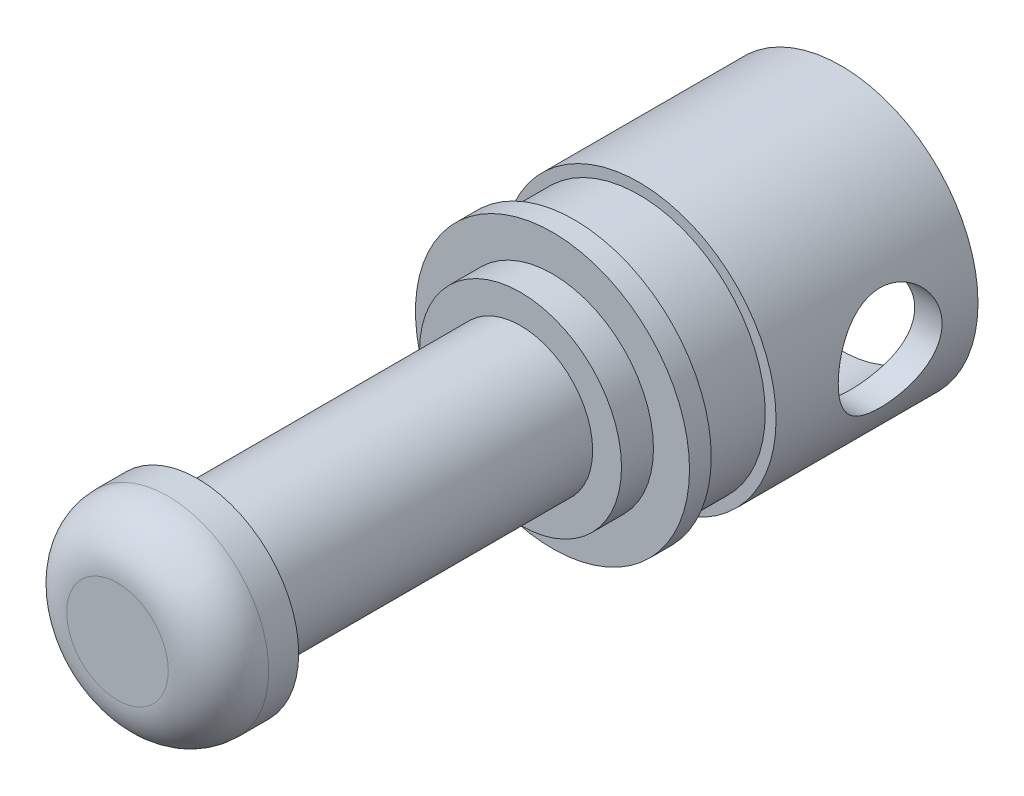
ISO-10303-21;
HEADER;
FILE_DESCRIPTION(('STEP AP214'),'2;1');
FILE_NAME('part.step','',(''),(''),'','','');
FILE_SCHEMA(('AUTOMOTIVE_DESIGN { 1 0 10303 214 1 1 1 1 }'));
ENDSEC;
DATA;
#1=APPLICATION_CONTEXT('core data for automotive mechanical design processes');
#2=APPLICATION_PROTOCOL_DEFINITION('international standard','automotive_design',2000,#1);
#3=PRODUCT_CONTEXT('',#1,'mechanical');
#4=PRODUCT('Part','Part','',(#3));
#5=PRODUCT_RELATED_PRODUCT_CATEGORY('part','',(#4));
#6=PRODUCT_DEFINITION_FORMATION('','',#4);
#7=PRODUCT_DEFINITION_CONTEXT('part definition',#1,'design');
#8=PRODUCT_DEFINITION('design','',#6,#7);
#9=PRODUCT_DEFINITION_SHAPE('','',#8);
#10=(LENGTH_UNIT() NAMED_UNIT(*) SI_UNIT(.MILLI.,.METRE.));
#11=(NAMED_UNIT(*) PLANE_ANGLE_UNIT() SI_UNIT($,.RADIAN.));
#12=(NAMED_UNIT(*) SI_UNIT($,.STERADIAN.) SOLID_ANGLE_UNIT());
#13=UNCERTAINTY_MEASURE_WITH_UNIT(LENGTH_MEASURE(1.E-05),#10,'distance_accuracy_value','');
#14=(GEOMETRIC_REPRESENTATION_CONTEXT(3) GLOBAL_UNCERTAINTY_ASSIGNED_CONTEXT((#13)) GLOBAL_UNIT_ASSIGNED_CONTEXT((#10,
#11,#12)) REPRESENTATION_CONTEXT('',''));
#15=CARTESIAN_POINT('',(0.,0.,0.));
#16=DIRECTION('',(0.,0.,1.));
#17=DIRECTION('',(1.,0.,0.));
#18=AXIS2_PLACEMENT_3D('',#15,#16,#17);
#19=CARTESIAN_POINT('',(0.,0.,12.02));
#20=DIRECTION('',(0.,0.,1.));
#21=DIRECTION('',(1.,0.,0.));
#22=AXIS2_PLACEMENT_3D('',#19,#20,#21);
#23=PLANE('',#22);
#24=CARTESIAN_POINT('',(0.,0.,12.02));
#25=DIRECTION('',(0.,0.,-1.));
#26=DIRECTION('',(1.,0.,0.));
#27=AXIS2_PLACEMENT_3D('',#24,#25,#26);
#28=CIRCLE('',#27,0.88);
#29=CARTESIAN_POINT('',(0.88,0.,12.02));
#30=VERTEX_POINT('',#29);
#31=CARTESIAN_POINT('',(-0.88,0.,12.02));
#32=VERTEX_POINT('',#31);
#33=EDGE_CURVE('E38',#30,#32,#28,.T.);
#34=ORIENTED_EDGE('',*,*,#33,.F.);
#35=CARTESIAN_POINT('',(0.,0.,12.02));
#36=DIRECTION('',(0.,0.,-1.));
#37=DIRECTION('',(-1.,0.,0.));
#38=AXIS2_PLACEMENT_3D('',#35,#36,#37);
#39=CIRCLE('',#38,0.88);
#40=EDGE_CURVE('E34',#32,#30,#39,.T.);
#41=ORIENTED_EDGE('',*,*,#40,.F.);
#42=EDGE_LOOP('',(#34,#41));
#43=FACE_BOUND('',#42,.T.);
#44=ADVANCED_FACE('F17',(#43),#23,.T.);
#45=CARTESIAN_POINT('',(0.,0.,11.15));
#46=DIRECTION('',(0.,0.,-1.));
#47=DIRECTION('',(-1.,0.,0.));
#48=AXIS2_PLACEMENT_3D('',#45,#46,#47);
#49=TOROIDAL_SURFACE('',#48,0.88,0.87);
#50=CARTESIAN_POINT('',(0.,0.,11.15));
#51=DIRECTION('',(0.,0.,1.));
#52=DIRECTION('',(1.,0.,0.));
#53=AXIS2_PLACEMENT_3D('',#50,#51,#52);
#54=CIRCLE('',#53,1.75);
#55=CARTESIAN_POINT('',(1.75,0.,11.15));
#56=VERTEX_POINT('',#55);
#57=EDGE_CURVE('E44',#56,#56,#54,.F.);
#58=ORIENTED_EDGE('',*,*,#57,.F.);
#59=EDGE_LOOP('',(#58));
#60=FACE_BOUND('',#59,.T.);
#61=ORIENTED_EDGE('',*,*,#33,.T.);
#62=ORIENTED_EDGE('',*,*,#40,.T.);
#63=EDGE_LOOP('',(#61,#62));
#64=FACE_BOUND('',#63,.T.);
#65=ADVANCED_FACE('F43',(#60,#64),#49,.T.);
#66=CARTESIAN_POINT('',(0.,0.,0.));
#67=DIRECTION('',(0.,0.,1.));
#68=DIRECTION('',(1.,0.,0.));
#69=AXIS2_PLACEMENT_3D('',#66,#67,#68);
#70=CYLINDRICAL_SURFACE('',#69,1.75);
#71=ORIENTED_EDGE('',*,*,#57,.T.);
#72=EDGE_LOOP('',(#71));
#73=FACE_BOUND('',#72,.T.);
#74=CARTESIAN_POINT('',(0.,0.,10.6298091430472));
#75=DIRECTION('',(0.,0.,1.));
#76=DIRECTION('',(1.,0.,0.));
#77=AXIS2_PLACEMENT_3D('',#74,#75,#76);
#78=CIRCLE('',#77,1.75);
#79=CARTESIAN_POINT('',(1.75,0.,10.6298091430472));
#80=VERTEX_POINT('',#79);
#81=EDGE_CURVE('E74',#80,#80,#78,.F.);
#82=ORIENTED_EDGE('',*,*,#81,.F.);
#83=EDGE_LOOP('',(#82));
#84=FACE_BOUND('',#83,.T.);
#85=ADVANCED_FACE('F60',(#73,#84),#70,.T.);
#86=CARTESIAN_POINT('',(-0.0662132772985357,1.74874692334522,10.6298091430472));
#87=DIRECTION('',(0.,0.,-1.));
#88=DIRECTION('',(-1.,0.,0.));
#89=AXIS2_PLACEMENT_3D('',#86,#87,#88);
#90=PLANE('',#89);
#91=ORIENTED_EDGE('',*,*,#81,.T.);
#92=EDGE_LOOP('',(#91));
#93=FACE_BOUND('',#92,.T.);
#94=CARTESIAN_POINT('',(0.,0.,10.6298091430472));
#95=DIRECTION('',(0.,0.,1.));
#96=DIRECTION('',(1.,0.,0.));
#97=AXIS2_PLACEMENT_3D('',#94,#95,#96);
#98=CIRCLE('',#97,1.25);
#99=CARTESIAN_POINT('',(1.25,0.,10.6298091430472));
#100=VERTEX_POINT('',#99);
#101=EDGE_CURVE('E78',#100,#100,#98,.F.);
#102=ORIENTED_EDGE('',*,*,#101,.F.);
#103=EDGE_LOOP('',(#102));
#104=FACE_BOUND('',#103,.T.);
#105=ADVANCED_FACE('F160',(#93,#104),#90,.T.);
#106=CARTESIAN_POINT('',(0.,0.,0.));
#107=DIRECTION('',(0.,0.,1.));
#108=DIRECTION('',(1.,0.,0.));
#109=AXIS2_PLACEMENT_3D('',#106,#107,#108);
#110=CYLINDRICAL_SURFACE('',#109,1.25);
#111=CARTESIAN_POINT('',(0.,0.,5.0348339473795));
#112=DIRECTION('',(0.,0.,1.));
#113=DIRECTION('',(1.,0.,0.));
#114=AXIS2_PLACEMENT_3D('',#111,#112,#113);
#115=CIRCLE('',#114,1.25);
#116=CARTESIAN_POINT('',(1.25,0.,5.0348339473795));
#117=VERTEX_POINT('',#116);
#118=EDGE_CURVE('E83',#117,#117,#115,.F.);
#119=ORIENTED_EDGE('',*,*,#118,.F.);
#120=EDGE_LOOP('',(#119));
#121=FACE_BOUND('',#120,.T.);
#122=ORIENTED_EDGE('',*,*,#101,.T.);
#123=EDGE_LOOP('',(#122));
#124=FACE_BOUND('',#123,.T.);
#125=ADVANCED_FACE('F157',(#121,#124),#110,.T.);
#126=CARTESIAN_POINT('',(-0.0662132772985357,1.74874692334522,5.0348339473795));
#127=DIRECTION('',(0.,0.,1.));
#128=DIRECTION('',(1.,0.,0.));
#129=AXIS2_PLACEMENT_3D('',#126,#127,#128);
#130=PLANE('',#129);
#131=CARTESIAN_POINT('',(0.,0.,5.0348339473795));
#132=DIRECTION('',(0.,0.,1.));
#133=DIRECTION('',(1.,0.,0.));
#134=AXIS2_PLACEMENT_3D('',#131,#132,#133);
#135=CIRCLE('',#134,1.75);
#136=CARTESIAN_POINT('',(1.75,0.,5.0348339473795));
#137=VERTEX_POINT('',#136);
#138=EDGE_CURVE('E88',#137,#137,#135,.F.);
#139=ORIENTED_EDGE('',*,*,#138,.F.);
#140=EDGE_LOOP('',(#139));
#141=FACE_BOUND('',#140,.T.);
#142=ORIENTED_EDGE('',*,*,#118,.T.);
#143=EDGE_LOOP('',(#142));
#144=FACE_BOUND('',#143,.T.);
#145=ADVANCED_FACE('F153',(#141,#144),#130,.T.);
#146=CARTESIAN_POINT('',(0.,0.,0.));
#147=DIRECTION('',(0.,0.,1.));
#148=DIRECTION('',(1.,0.,0.));
#149=AXIS2_PLACEMENT_3D('',#146,#147,#148);
#150=CYLINDRICAL_SURFACE('',#149,1.75);
#151=ORIENTED_EDGE('',*,*,#138,.T.);
#152=EDGE_LOOP('',(#151));
#153=FACE_BOUND('',#152,.T.);
#154=CARTESIAN_POINT('',(0.,0.,4.480935244148));
#155=DIRECTION('',(0.,0.,1.));
#156=DIRECTION('',(1.,0.,0.));
#157=AXIS2_PLACEMENT_3D('',#154,#155,#156);
#158=CIRCLE('',#157,1.75);
#159=CARTESIAN_POINT('',(1.75,0.,4.480935244148));
#160=VERTEX_POINT('',#159);
#161=EDGE_CURVE('E91',#160,#160,#158,.F.);
#162=ORIENTED_EDGE('',*,*,#161,.F.);
#163=EDGE_LOOP('',(#162));
#164=FACE_BOUND('',#163,.T.);
#165=ADVANCED_FACE('F149',(#153,#164),#150,.T.);
#166=CARTESIAN_POINT('',(-0.889222465921489,1.50724364523474,4.480935244148));
#167=DIRECTION('',(0.,0.,1.));
#168=DIRECTION('',(1.,0.,0.));
#169=AXIS2_PLACEMENT_3D('',#166,#167,#168);
#170=PLANE('',#169);
#171=ORIENTED_EDGE('',*,*,#161,.T.);
#172=EDGE_LOOP('',(#171));
#173=FACE_BOUND('',#172,.T.);
#174=CARTESIAN_POINT('',(0.,0.,4.480935244148));
#175=DIRECTION('',(0.,0.,1.));
#176=DIRECTION('',(1.,0.,0.));
#177=AXIS2_PLACEMENT_3D('',#174,#175,#176);
#178=CIRCLE('',#177,2.375);
#179=CARTESIAN_POINT('',(2.375,0.,4.480935244148));
#180=VERTEX_POINT('',#179);
#181=EDGE_CURVE('E94',#180,#180,#178,.F.);
#182=ORIENTED_EDGE('',*,*,#181,.F.);
#183=EDGE_LOOP('',(#182));
#184=FACE_BOUND('',#183,.T.);
#185=ADVANCED_FACE('F145',(#173,#184),#170,.T.);
#186=CARTESIAN_POINT('',(0.,0.,0.));
#187=DIRECTION('',(0.,0.,1.));
#188=DIRECTION('',(1.,0.,0.));
#189=AXIS2_PLACEMENT_3D('',#186,#187,#188);
#190=CYLINDRICAL_SURFACE('',#189,2.375);
#191=ORIENTED_EDGE('',*,*,#181,.T.);
#192=EDGE_LOOP('',(#191));
#193=FACE_BOUND('',#192,.T.);
#194=CARTESIAN_POINT('',(0.,0.,4.10469700824041));
#195=DIRECTION('',(0.,0.,1.));
#196=DIRECTION('',(1.,0.,0.));
#197=AXIS2_PLACEMENT_3D('',#194,#195,#196);
#198=CIRCLE('',#197,2.375);
#199=CARTESIAN_POINT('',(2.375,0.,4.10469700824041));
#200=VERTEX_POINT('',#199);
#201=EDGE_CURVE('E97',#200,#200,#198,.F.);
#202=ORIENTED_EDGE('',*,*,#201,.F.);
#203=EDGE_LOOP('',(#202));
#204=FACE_BOUND('',#203,.T.);
#205=ADVANCED_FACE('F141',(#193,#204),#190,.T.);
#206=CARTESIAN_POINT('',(-0.889222465921489,1.50724364523474,4.10469700824041));
#207=DIRECTION('',(0.,0.,-1.));
#208=DIRECTION('',(-1.,0.,0.));
#209=AXIS2_PLACEMENT_3D('',#206,#207,#208);
#210=PLANE('',#209);
#211=CARTESIAN_POINT('',(0.,0.,4.10469700824041));
#212=DIRECTION('',(0.,0.,1.));
#213=DIRECTION('',(1.,0.,0.));
#214=AXIS2_PLACEMENT_3D('',#211,#212,#213);
#215=CIRCLE('',#214,2.1875);
#216=CARTESIAN_POINT('',(2.1875,0.,4.10469700824041));
#217=VERTEX_POINT('',#216);
#218=EDGE_CURVE('E100',#217,#217,#215,.F.);
#219=ORIENTED_EDGE('',*,*,#218,.F.);
#220=EDGE_LOOP('',(#219));
#221=FACE_BOUND('',#220,.T.);
#222=ORIENTED_EDGE('',*,*,#201,.T.);
#223=EDGE_LOOP('',(#222));
#224=FACE_BOUND('',#223,.T.);
#225=ADVANCED_FACE('F137',(#221,#224),#210,.T.);
#226=CARTESIAN_POINT('',(0.,0.,0.));
#227=DIRECTION('',(0.,0.,1.));
#228=DIRECTION('',(1.,0.,0.));
#229=AXIS2_PLACEMENT_3D('',#226,#227,#228);
#230=CYLINDRICAL_SURFACE('',#229,2.1875);
#231=ORIENTED_EDGE('',*,*,#218,.T.);
#232=EDGE_LOOP('',(#231));
#233=FACE_BOUND('',#232,.T.);
#234=CARTESIAN_POINT('',(0.,0.,2.980935244148));
#235=DIRECTION('',(0.,0.,1.));
#236=DIRECTION('',(1.,0.,0.));
#237=AXIS2_PLACEMENT_3D('',#234,#235,#236);
#238=CIRCLE('',#237,2.1875);
#239=CARTESIAN_POINT('',(2.1875,0.,2.980935244148));
#240=VERTEX_POINT('',#239);
#241=EDGE_CURVE('E103',#240,#240,#238,.F.);
#242=ORIENTED_EDGE('',*,*,#241,.F.);
#243=EDGE_LOOP('',(#242));
#244=FACE_BOUND('',#243,.T.);
#245=ADVANCED_FACE('F133',(#233,#244),#230,.T.);
#246=CARTESIAN_POINT('',(-0.889222465921489,1.50724364523474,2.980935244148));
#247=DIRECTION('',(0.,0.,1.));
#248=DIRECTION('',(1.,0.,0.));
#249=AXIS2_PLACEMENT_3D('',#246,#247,#248);
#250=PLANE('',#249);
#251=CARTESIAN_POINT('',(0.,0.,2.980935244148));
#252=DIRECTION('',(0.,0.,1.));
#253=DIRECTION('',(1.,0.,0.));
#254=AXIS2_PLACEMENT_3D('',#251,#252,#253);
#255=CIRCLE('',#254,2.375);
#256=CARTESIAN_POINT('',(2.375,0.,2.980935244148));
#257=VERTEX_POINT('',#256);
#258=EDGE_CURVE('E106',#257,#257,#255,.F.);
#259=ORIENTED_EDGE('',*,*,#258,.F.);
#260=EDGE_LOOP('',(#259));
#261=FACE_BOUND('',#260,.T.);
#262=ORIENTED_EDGE('',*,*,#241,.T.);
#263=EDGE_LOOP('',(#262));
#264=FACE_BOUND('',#263,.T.);
#265=ADVANCED_FACE('F129',(#261,#264),#250,.T.);
#266=CARTESIAN_POINT('',(0.,0.,0.));
#267=DIRECTION('',(0.,0.,1.));
#268=DIRECTION('',(1.,0.,0.));
#269=AXIS2_PLACEMENT_3D('',#266,#267,#268);
#270=CYLINDRICAL_SURFACE('',#269,2.375);
#271=CARTESIAN_POINT('',(0.,0.,-0.519064755852001));
#272=DIRECTION('',(0.,0.,1.));
#273=DIRECTION('',(1.,0.,0.));
#274=AXIS2_PLACEMENT_3D('',#271,#272,#273);
#275=CIRCLE('',#274,2.375);
#276=CARTESIAN_POINT('',(2.375,0.,-0.519064755852001));
#277=VERTEX_POINT('',#276);
#278=EDGE_CURVE('E109',#277,#277,#275,.T.);
#279=ORIENTED_EDGE('',*,*,#278,.T.);
#280=EDGE_LOOP('',(#279));
#281=FACE_BOUND('',#280,.T.);
#282=ORIENTED_EDGE('',*,*,#258,.T.);
#283=EDGE_LOOP('',(#282));
#284=FACE_BOUND('',#283,.T.);
#285=CARTESIAN_POINT('',(2.19786828540748,-0.9,1.00335818543237));
#286=CARTESIAN_POINT('',(2.19787029901936,-0.899997954880836,1.05187777166198));
#287=CARTESIAN_POINT('',(2.19949473336649,-0.896059081819069,1.10041910933173));
#288=CARTESIAN_POINT('',(2.20578213547849,-0.880464406069073,1.19606320850285));
#289=CARTESIAN_POINT('',(2.21044776480495,-0.868801843699061,1.2431646720336));
#290=CARTESIAN_POINT('',(2.22221022151569,-0.838255036308254,1.33447798457018));
#291=CARTESIAN_POINT('',(2.22930019346178,-0.81939113755076,1.37869756751418));
#292=CARTESIAN_POINT('',(2.24510284344058,-0.775042135694973,1.4633525914942));
#293=CARTESIAN_POINT('',(2.2538157358467,-0.749556157702849,1.50378753155105));
#294=CARTESIAN_POINT('',(2.27237880139204,-0.691299400381519,1.58178938268127));
#295=CARTESIAN_POINT('',(2.28226291328788,-0.65824655745323,1.61913761334668));
#296=CARTESIAN_POINT('',(2.30177379376686,-0.586384901121995,1.68792199402992));
#297=CARTESIAN_POINT('',(2.31140046055085,-0.547573849390684,1.71935583418266));
#298=CARTESIAN_POINT('',(2.32971775696357,-0.463625326805697,1.7764808393245));
#299=CARTESIAN_POINT('',(2.33836349034561,-0.418313210102452,1.80193081619328));
#300=CARTESIAN_POINT('',(2.35332410946359,-0.323689143022334,1.84473449384934));
#301=CARTESIAN_POINT('',(2.35964183060601,-0.274382148143775,1.86209805035564));
#302=CARTESIAN_POINT('',(2.36787854457283,-0.187405510573351,1.88443511613629));
#303=CARTESIAN_POINT('',(2.37053334371841,-0.150333336344609,1.89151490024203));
#304=CARTESIAN_POINT('',(2.37409456705135,-0.0755117178548224,1.90097693567649));
#305=CARTESIAN_POINT('',(2.375001179895,-0.0377623471175418,1.90335969388742));
#306=CARTESIAN_POINT('',(2.3749984795776,0.0486608709097025,1.9033562416248));
#307=CARTESIAN_POINT('',(2.37348955919515,0.0973432892434525,1.89939519644532));
#308=CARTESIAN_POINT('',(2.36761130316949,0.193281248913484,1.88370440549388));
#309=CARTESIAN_POINT('',(2.36323967267138,0.240535613648357,1.87196842695793));
#310=CARTESIAN_POINT('',(2.35210800749596,0.332173964626392,1.84120736339772));
#311=CARTESIAN_POINT('',(2.34535358067677,0.376564403370612,1.82219938406816));
#312=CARTESIAN_POINT('',(2.33012781234027,0.461513005987586,1.77750984811322));
#313=CARTESIAN_POINT('',(2.32165632180956,0.502070836803644,1.7518277122242));
#314=CARTESIAN_POINT('',(2.30345929207839,0.579967967502448,1.69335850521436));
#315=CARTESIAN_POINT('',(2.29369774313747,0.617120196221575,1.66033351609326));
#316=CARTESIAN_POINT('',(2.27419420485044,0.685516804393749,1.588613447544));
#317=CARTESIAN_POINT('',(2.26445222739562,0.716758287564409,1.54991560479906));
#318=CARTESIAN_POINT('',(2.24566774093994,0.773650833324982,1.46609976530032));
#319=CARTESIAN_POINT('',(2.23666797347588,0.799032809210327,1.42078875103538));
#320=CARTESIAN_POINT('',(2.22096145717471,0.841710877413735,1.32617093902632));
#321=CARTESIAN_POINT('',(2.21425174393602,0.859017433845175,1.27686940999654));
#322=CARTESIAN_POINT('',(2.20548527434867,0.881224528890244,1.19003494769746));
#323=CARTESIAN_POINT('',(2.20264958224555,0.888248451323271,1.15311107004654));
#324=CARTESIAN_POINT('',(2.19884044197844,0.897636642390358,1.07858181555175));
#325=CARTESIAN_POINT('',(2.1978667242078,0.900001585627992,1.04097653816804));
#326=CARTESIAN_POINT('',(2.19787029901936,0.899997954880836,0.954838599202761));
#327=CARTESIAN_POINT('',(2.19949473336649,0.896059081819069,0.906297261533007));
#328=CARTESIAN_POINT('',(2.20578213547849,0.880464406069073,0.810653162361888));
#329=CARTESIAN_POINT('',(2.21044776480495,0.868801843699061,0.763551698831139));
#330=CARTESIAN_POINT('',(2.22221022151569,0.838255036308254,0.672238386294561));
#331=CARTESIAN_POINT('',(2.22930019346178,0.81939113755076,0.628018803350561));
#332=CARTESIAN_POINT('',(2.24510284344058,0.775042135694973,0.543363779370538));
#333=CARTESIAN_POINT('',(2.2538157358467,0.749556157702849,0.502928839313692));
#334=CARTESIAN_POINT('',(2.27237880139204,0.691299400381519,0.424926988183469));
#335=CARTESIAN_POINT('',(2.28226291328788,0.65824655745323,0.387578757518063));
#336=CARTESIAN_POINT('',(2.30177379376686,0.586384901121995,0.318794376834817));
#337=CARTESIAN_POINT('',(2.31140046055085,0.547573849390684,0.287360536682078));
#338=CARTESIAN_POINT('',(2.32971775696357,0.463625326805697,0.230235531540241));
#339=CARTESIAN_POINT('',(2.33836349034561,0.418313210102452,0.204785554671459));
#340=CARTESIAN_POINT('',(2.35332410946359,0.323689143022334,0.161981877015402));
#341=CARTESIAN_POINT('',(2.35964183060601,0.274382148143775,0.144618320509102));
#342=CARTESIAN_POINT('',(2.36787854457283,0.187405510573351,0.122281254728446));
#343=CARTESIAN_POINT('',(2.37053334371841,0.150333336344609,0.115201470622708));
#344=CARTESIAN_POINT('',(2.37409456705135,0.0755117178548222,0.105739435188254));
#345=CARTESIAN_POINT('',(2.375001179895,0.0377623471175415,0.103356676977324));
#346=CARTESIAN_POINT('',(2.3749984795776,-0.0486608709097028,0.103360129239943));
#347=CARTESIAN_POINT('',(2.37348955919515,-0.0973432892434528,0.10732117441942));
#348=CARTESIAN_POINT('',(2.36761130316949,-0.193281248913485,0.123011965370865));
#349=CARTESIAN_POINT('',(2.36323967267138,-0.240535613648358,0.13474794390681));
#350=CARTESIAN_POINT('',(2.35210800749596,-0.332173964626392,0.165509007467023));
#351=CARTESIAN_POINT('',(2.34535358067677,-0.376564403370612,0.18451698679658));
#352=CARTESIAN_POINT('',(2.33012781234027,-0.461513005987586,0.229206522751524));
#353=CARTESIAN_POINT('',(2.32165632180956,-0.502070836803644,0.254888658640545));
#354=CARTESIAN_POINT('',(2.30345929207839,-0.579967967502448,0.313357865650381));
#355=CARTESIAN_POINT('',(2.29369774313747,-0.617120196221575,0.346382854771479));
#356=CARTESIAN_POINT('',(2.27419420485044,-0.685516804393749,0.418102923320739));
#357=CARTESIAN_POINT('',(2.26445222739562,-0.716758287564409,0.456800766065676));
#358=CARTESIAN_POINT('',(2.24566774093994,-0.773650833324982,0.540616605564421));
#359=CARTESIAN_POINT('',(2.23666797347588,-0.799032809210327,0.585927619829363));
#360=CARTESIAN_POINT('',(2.22096145717471,-0.841710877413735,0.680545431838419));
#361=CARTESIAN_POINT('',(2.21425174393602,-0.859017433845175,0.729846960868198));
#362=CARTESIAN_POINT('',(2.20548527434867,-0.881224528890244,0.81668142316728));
#363=CARTESIAN_POINT('',(2.20264958224555,-0.888248451323271,0.853605300818196));
#364=CARTESIAN_POINT('',(2.19884044197844,-0.897636642390358,0.928134555312989));
#365=CARTESIAN_POINT('',(2.1978667242078,-0.900001585627992,0.965739832696698));
#366=CARTESIAN_POINT('',(2.19786828540748,-0.9,1.00335818543237));
#367=B_SPLINE_CURVE_WITH_KNOTS('',3,(#285,#286,#287,#288,#289,#290,#291,#292,#293,#294,#295,
#296,#297,#298,#299,#300,#301,#302,#303,#304,#305,#306,#307,#308,#309,#310,#311,#312,#313,#314,
#315,#316,#317,#318,#319,#320,#321,#322,#323,#324,#325,#326,#327,#328,#329,#330,#331,#332,#333,
#334,#335,#336,#337,#338,#339,#340,#341,#342,#343,#344,#345,#346,#347,#348,#349,#350,#351,#352,
#353,#354,#355,#356,#357,#358,#359,#360,#361,#362,#363,#364,#365,#366),.UNSPECIFIED.,.T.,.F.,(4,
2,2,2,2,2,2,2,2,2,2,2,2,2,2,2,2,2,2,2,2,2,2,2,2,2,2,2,2,2,2,2,2,2,2,2,2,2,2,2,4),(0.,
0.145414768599287,0.290956970969297,0.436090973755428,0.581244161069677,0.733100601357813,
0.885016226627322,1.04228115639521,1.19935390697636,1.31254225165257,1.42571838087549,
1.57155807132253,1.71751481564465,1.8631303208094,2.00875846846361,2.16006291877245,
2.31144131776353,2.46879015532588,2.62593453042972,2.73869427821365,2.85143769758778,
2.99685246618707,3.14239466855708,3.28752867134321,3.43268185865746,3.5845382989456,
3.7364539242151,3.893718853983,4.05079160456414,4.16397994924036,4.27715607846327,
4.42299576891032,4.56895251323243,4.71456801839719,4.86019616605139,5.01150061636023,
5.16287901535131,5.32022785291366,5.4773722280175,5.59013197580143,5.70287539517557),.UNSPECIFIED.);
#368=CARTESIAN_POINT('',(2.19786828540748,-0.9,1.00335818543237));
#369=VERTEX_POINT('',#368);
#370=EDGE_CURVE('E112',#369,#369,#367,.T.);
#371=ORIENTED_EDGE('',*,*,#370,.T.);
#372=EDGE_LOOP('',(#371));
#373=FACE_BOUND('',#372,.T.);
#374=ADVANCED_FACE('F124',(#281,#284,#373),#270,.T.);
#375=CARTESIAN_POINT('',(0.,0.,-0.519064755852001));
#376=DIRECTION('',(0.,0.,1.));
#377=DIRECTION('',(1.,0.,0.));
#378=AXIS2_PLACEMENT_3D('',#375,#376,#377);
#379=PLANE('',#378);
#380=ORIENTED_EDGE('',*,*,#278,.F.);
#381=EDGE_LOOP('',(#380));
#382=FACE_BOUND('',#381,.T.);
#383=CARTESIAN_POINT('',(0.,0.,-0.519064755852001));
#384=DIRECTION('',(0.,0.,-1.));
#385=DIRECTION('',(-1.,0.,0.));
#386=AXIS2_PLACEMENT_3D('',#383,#384,#385);
#387=CIRCLE('',#386,1.9);
#388=CARTESIAN_POINT('',(-1.9,0.,-0.519064755852001));
#389=VERTEX_POINT('',#388);
#390=EDGE_CURVE('E119',#389,#389,#387,.F.);
#391=ORIENTED_EDGE('',*,*,#390,.T.);
#392=EDGE_LOOP('',(#391));
#393=FACE_BOUND('',#392,.T.);
#394=ADVANCED_FACE('F128',(#382,#393),#379,.F.);
#395=CARTESIAN_POINT('',(0.,0.,1.00335818543237));
#396=DIRECTION('',(1.,0.,0.));
#397=DIRECTION('',(0.,0.,-1.));
#398=AXIS2_PLACEMENT_3D('',#395,#396,#397);
#399=CYLINDRICAL_SURFACE('',#398,0.9);
#400=ORIENTED_EDGE('',*,*,#370,.F.);
#401=EDGE_LOOP('',(#400));
#402=FACE_BOUND('',#401,.T.);
#403=CARTESIAN_POINT('',(1.9,0.,0.10335818543237));
#404=CARTESIAN_POINT('',(1.89999871690515,-0.0476738019602449,0.103359650099982));
#405=CARTESIAN_POINT('',(1.89818851073326,-0.0953618199562382,0.10716346976264));
#406=CARTESIAN_POINT('',(1.89113430900034,-0.189300390612177,0.122204474372804));
#407=CARTESIAN_POINT('',(1.88588809637015,-0.235549994944752,0.133446458813708));
#408=CARTESIAN_POINT('',(1.87251394322574,-0.325176425408232,0.162835494242659));
#409=CARTESIAN_POINT('',(1.86439507514142,-0.368561791317893,0.180960819304037));
#410=CARTESIAN_POINT('',(1.84603282613723,-0.451636227689504,0.223483661304181));
#411=CARTESIAN_POINT('',(1.83578907857407,-0.491324658538608,0.247882260856944));
#412=CARTESIAN_POINT('',(1.81346972692596,-0.568352151029684,0.303811168724101));
#413=CARTESIAN_POINT('',(1.80132384058499,-0.605436935599023,0.335663202014357));
#414=CARTESIAN_POINT('',(1.7768202831698,-0.673970988653647,0.404911247083715));
#415=CARTESIAN_POINT('',(1.7644624635201,-0.705416110395334,0.442311301606233));
#416=CARTESIAN_POINT('',(1.73997498293743,-0.76391115640832,0.524651059040854));
#417=CARTESIAN_POINT('',(1.72791814241388,-0.790516064417238,0.569930729367835));
#418=CARTESIAN_POINT('',(1.70657464300839,-0.835601794308674,0.664943214327021));
#419=CARTESIAN_POINT('',(1.69728405852849,-0.854094146555782,0.714669586974628));
#420=CARTESIAN_POINT('',(1.68468617286531,-0.878618684025586,0.804316107960125));
#421=CARTESIAN_POINT('',(1.68046360808677,-0.886610389554073,0.843578739403436));
#422=CARTESIAN_POINT('',(1.6747802100049,-0.897300740829197,0.923010415518419));
#423=CARTESIAN_POINT('',(1.67331832778625,-0.900001396913171,0.963179110060763));
#424=CARTESIAN_POINT('',(1.67332208563498,-0.899998354286699,1.05069343873212));
#425=CARTESIAN_POINT('',(1.67535551218073,-0.896246431134255,1.09804309996162));
#426=CARTESIAN_POINT('',(1.68319541296021,-0.881430614113804,1.19127604835341));
#427=CARTESIAN_POINT('',(1.68900509696711,-0.870360499735132,1.23715805318383));
#428=CARTESIAN_POINT('',(1.70357907120777,-0.841472637670431,1.3259999925228));
#429=CARTESIAN_POINT('',(1.71233062071786,-0.823683946643738,1.36897158339641));
#430=CARTESIAN_POINT('',(1.73178220617609,-0.781958241299157,1.45132524781876));
#431=CARTESIAN_POINT('',(1.74248275984672,-0.758019592645934,1.490706363433));
#432=CARTESIAN_POINT('',(1.76558808547428,-0.702611514902505,1.56794540485739));
#433=CARTESIAN_POINT('',(1.77806030075188,-0.670718189607947,1.60547916426623));
#434=CARTESIAN_POINT('',(1.80275774516848,-0.601186729641264,1.67491608184963));
#435=CARTESIAN_POINT('',(1.81498284388746,-0.563545646737322,1.70681633218166));
#436=CARTESIAN_POINT('',(1.83867565936106,-0.480861100084789,1.765922884903));
#437=CARTESIAN_POINT('',(1.8500554051105,-0.435510948092183,1.7927383949816));
#438=CARTESIAN_POINT('',(1.86990179380007,-0.340323097934722,1.83819518812594));
#439=CARTESIAN_POINT('',(1.87837215235864,-0.290491226896771,1.85684690570173));
#440=CARTESIAN_POINT('',(1.8897994020737,-0.200467441271667,1.88166852981734));
#441=CARTESIAN_POINT('',(1.89359895561935,-0.16090811298016,1.88977763705899));
#442=CARTESIAN_POINT('',(1.8986995091319,-0.0809024636033595,1.90062246292888));
#443=CARTESIAN_POINT('',(1.90000108884404,-0.0404563505330944,1.90335942836043));
#444=CARTESIAN_POINT('',(1.89999871690515,0.0476738019602451,1.90335672076476));
#445=CARTESIAN_POINT('',(1.89818851073326,0.0953618199562383,1.8995529011021));
#446=CARTESIAN_POINT('',(1.89113430900034,0.189300390612177,1.88451189649194));
#447=CARTESIAN_POINT('',(1.88588809637015,0.235549994944752,1.87326991205103));
#448=CARTESIAN_POINT('',(1.87251394322574,0.325176425408232,1.84388087662208));
#449=CARTESIAN_POINT('',(1.86439507514142,0.368561791317893,1.8257555515607));
#450=CARTESIAN_POINT('',(1.84603282613723,0.451636227689504,1.78323270956056));
#451=CARTESIAN_POINT('',(1.83578907857407,0.491324658538609,1.7588341100078));
#452=CARTESIAN_POINT('',(1.81346972692596,0.568352151029684,1.70290520214064));
#453=CARTESIAN_POINT('',(1.80132384058499,0.605436935599023,1.67105316885038));
#454=CARTESIAN_POINT('',(1.7768202831698,0.673970988653647,1.60180512378103));
#455=CARTESIAN_POINT('',(1.7644624635201,0.705416110395334,1.56440506925851));
#456=CARTESIAN_POINT('',(1.73997498293743,0.76391115640832,1.48206531182389));
#457=CARTESIAN_POINT('',(1.72791814241388,0.790516064417238,1.43678564149691));
#458=CARTESIAN_POINT('',(1.70657464300839,0.835601794308674,1.34177315653772));
#459=CARTESIAN_POINT('',(1.69728405852849,0.854094146555782,1.29204678389011));
#460=CARTESIAN_POINT('',(1.68468617286531,0.878618684025586,1.20240026290462));
#461=CARTESIAN_POINT('',(1.68046360808677,0.886610389554073,1.1631376314613));
#462=CARTESIAN_POINT('',(1.6747802100049,0.897300740829197,1.08370595534632));
#463=CARTESIAN_POINT('',(1.67331832778625,0.900001396913171,1.04353726080398));
#464=CARTESIAN_POINT('',(1.67332208563498,0.899998354286699,0.956022932132624));
#465=CARTESIAN_POINT('',(1.67535551218073,0.896246431134255,0.908673270903118));
#466=CARTESIAN_POINT('',(1.68319541296021,0.881430614113804,0.815440322511333));
#467=CARTESIAN_POINT('',(1.68900509696711,0.870360499735132,0.769558317680907));
#468=CARTESIAN_POINT('',(1.70357907120777,0.841472637670431,0.680716378341938));
#469=CARTESIAN_POINT('',(1.71233062071786,0.823683946643737,0.63774478746833));
#470=CARTESIAN_POINT('',(1.73178220617609,0.781958241299157,0.555391123045985));
#471=CARTESIAN_POINT('',(1.74248275984672,0.758019592645934,0.516010007431736));
#472=CARTESIAN_POINT('',(1.76558808547428,0.702611514902505,0.438770966007354));
#473=CARTESIAN_POINT('',(1.77806030075188,0.670718189607947,0.401237206598515));
#474=CARTESIAN_POINT('',(1.80275774516848,0.601186729641264,0.331800289015114));
#475=CARTESIAN_POINT('',(1.81498284388746,0.563545646737322,0.299900038683082));
#476=CARTESIAN_POINT('',(1.83867565936106,0.480861100084789,0.240793485961743));
#477=CARTESIAN_POINT('',(1.8500554051105,0.435510948092183,0.213977975883139));
#478=CARTESIAN_POINT('',(1.86990179380007,0.340323097934722,0.1685211827388));
#479=CARTESIAN_POINT('',(1.87837215235864,0.290491226896771,0.149869465163012));
#480=CARTESIAN_POINT('',(1.8897994020737,0.200467441271667,0.125047841047404));
#481=CARTESIAN_POINT('',(1.89359895561935,0.16090811298016,0.116938733805754));
#482=CARTESIAN_POINT('',(1.8986995091319,0.0809024636033599,0.106093907935857));
#483=CARTESIAN_POINT('',(1.90000108884404,0.0404563505330948,0.103356942504308));
#484=CARTESIAN_POINT('',(1.9,0.,0.10335818543237));
#485=B_SPLINE_CURVE_WITH_KNOTS('',3,(#403,#404,#405,#406,#407,#408,#409,#410,#411,#412,#413,
#414,#415,#416,#417,#418,#419,#420,#421,#422,#423,#424,#425,#426,#427,#428,#429,#430,#431,#432,
#433,#434,#435,#436,#437,#438,#439,#440,#441,#442,#443,#444,#445,#446,#447,#448,#449,#450,#451,
#452,#453,#454,#455,#456,#457,#458,#459,#460,#461,#462,#463,#464,#465,#466,#467,#468,#469,#470,
#471,#472,#473,#474,#475,#476,#477,#478,#479,#480,#481,#482,#483,#484),.UNSPECIFIED.,.T.,.F.,(4,
2,2,2,2,2,2,2,2,2,2,2,2,2,2,2,2,2,2,2,2,2,2,2,2,2,2,2,2,2,2,2,2,2,2,2,2,2,2,2,4),(0.,
0.142865440710354,0.285823155702232,0.428333352961097,0.57086816052683,0.721348139342682,
0.87193831379968,1.03278147698095,1.19339528743996,1.31384311808978,1.4342451756337,
1.5760916924821,1.71805893509854,1.85941909733125,2.00081686459083,2.15259702443106,
2.30445530093548,2.46532350697118,2.62598549538859,2.74725034106104,2.86848703943183,
3.01135248014219,3.15431019513406,3.29682039239293,3.43935519995866,3.58983517877451,
3.74042535323151,3.90126851641278,4.06188232687179,4.18233015752161,4.30273221506553,
4.44457873191393,4.58654597453037,4.72790613676308,4.86930390402266,5.02108406386289,
5.17294234036731,5.33381054640301,5.49447253482042,5.61573738049287,5.73697407886366),.UNSPECIFIED.);
#486=CARTESIAN_POINT('',(1.9,0.,0.10335818543237));
#487=VERTEX_POINT('',#486);
#488=EDGE_CURVE('E28',#487,#487,#485,.T.);
#489=ORIENTED_EDGE('',*,*,#488,.T.);
#490=EDGE_LOOP('',(#489));
#491=FACE_BOUND('',#490,.T.);
#492=ADVANCED_FACE('F120',(#402,#491),#399,.F.);
#493=CARTESIAN_POINT('',(0.,0.,4.1));
#494=DIRECTION('',(0.,0.,1.));
#495=DIRECTION('',(1.,0.,0.));
#496=AXIS2_PLACEMENT_3D('',#493,#494,#495);
#497=PLANE('',#496);
#498=CARTESIAN_POINT('',(0.,0.,4.1));
#499=DIRECTION('',(0.,0.,-1.));
#500=DIRECTION('',(-1.,0.,0.));
#501=AXIS2_PLACEMENT_3D('',#498,#499,#500);
#502=CIRCLE('',#501,1.9);
#503=CARTESIAN_POINT('',(-1.9,0.,4.1));
#504=VERTEX_POINT('',#503);
#505=EDGE_CURVE('E11',#504,#504,#502,.T.);
#506=ORIENTED_EDGE('',*,*,#505,.T.);
#507=EDGE_LOOP('',(#506));
#508=FACE_BOUND('',#507,.T.);
#509=ADVANCED_FACE('F170',(#508),#497,.F.);
#510=CARTESIAN_POINT('',(0.,0.,-1.26));
#511=DIRECTION('',(0.,0.,-1.));
#512=DIRECTION('',(-1.,0.,0.));
#513=AXIS2_PLACEMENT_3D('',#510,#511,#512);
#514=CYLINDRICAL_SURFACE('',#513,1.9);
#515=ORIENTED_EDGE('',*,*,#488,.F.);
#516=EDGE_LOOP('',(#515));
#517=FACE_BOUND('',#516,.T.);
#518=ORIENTED_EDGE('',*,*,#505,.F.);
#519=EDGE_LOOP('',(#518));
#520=FACE_BOUND('',#519,.T.);
#521=ORIENTED_EDGE('',*,*,#390,.F.);
#522=EDGE_LOOP('',(#521));
#523=FACE_BOUND('',#522,.T.);
#524=ADVANCED_FACE('F168',(#517,#520,#523),#514,.F.);
#525=CLOSED_SHELL('',(#44,#65,#85,#105,#125,#145,#165,#185,#205,#225,#245,#265,#374,#394,#492,
#509,#524));
#526=MANIFOLD_SOLID_BREP('B1',#525);
#527=ADVANCED_BREP_SHAPE_REPRESENTATION('',(#18,#526),#14);
#528=SHAPE_DEFINITION_REPRESENTATION(#9,#527);
ENDSEC;
END-ISO-10303-21;
